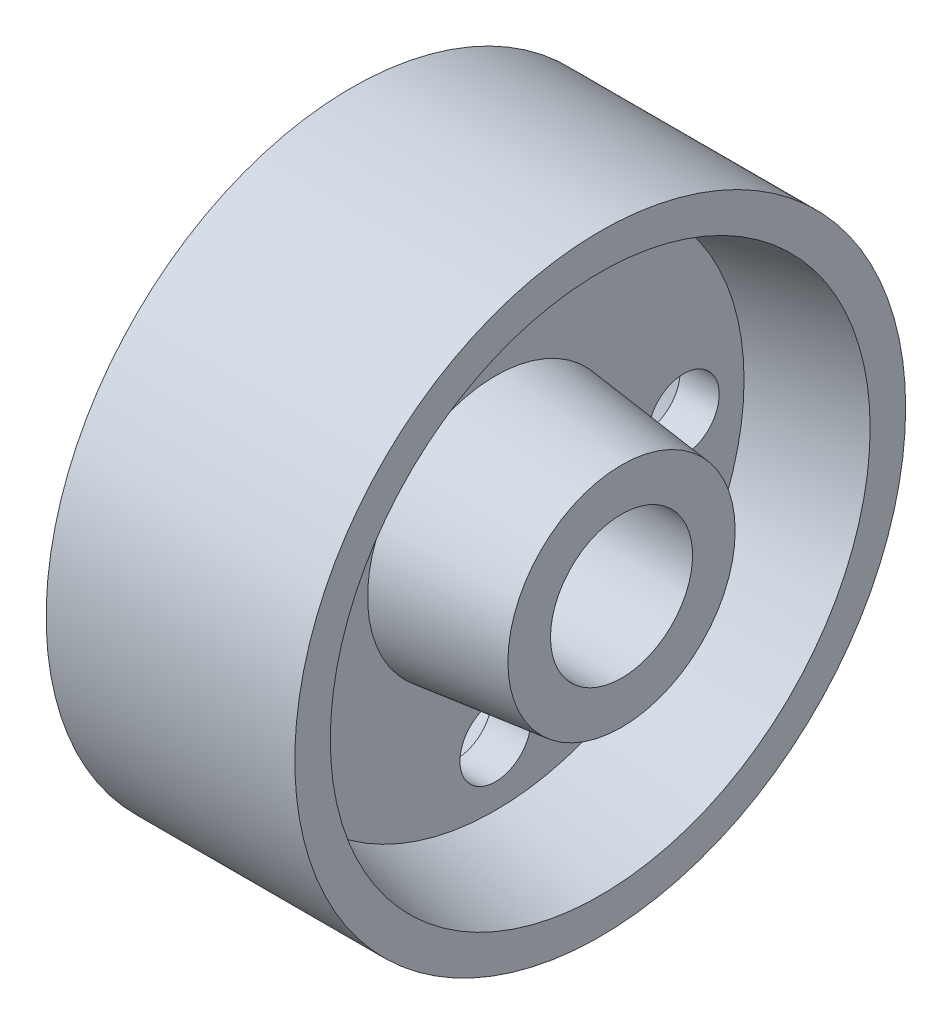
ISO-10303-21;
HEADER;
FILE_DESCRIPTION(('STEP AP214'),'2;1');
FILE_NAME('part.step','',(''),(''),'','','');
FILE_SCHEMA(('AUTOMOTIVE_DESIGN { 1 0 10303 214 1 1 1 1 }'));
ENDSEC;
DATA;
#1=APPLICATION_CONTEXT('core data for automotive mechanical design processes');
#2=APPLICATION_PROTOCOL_DEFINITION('international standard','automotive_design',2000,#1);
#3=PRODUCT_CONTEXT('',#1,'mechanical');
#4=PRODUCT('Part','Part','',(#3));
#5=PRODUCT_RELATED_PRODUCT_CATEGORY('part','',(#4));
#6=PRODUCT_DEFINITION_FORMATION('','',#4);
#7=PRODUCT_DEFINITION_CONTEXT('part definition',#1,'design');
#8=PRODUCT_DEFINITION('design','',#6,#7);
#9=PRODUCT_DEFINITION_SHAPE('','',#8);
#10=(LENGTH_UNIT() NAMED_UNIT(*) SI_UNIT(.MILLI.,.METRE.));
#11=(NAMED_UNIT(*) PLANE_ANGLE_UNIT() SI_UNIT($,.RADIAN.));
#12=(NAMED_UNIT(*) SI_UNIT($,.STERADIAN.) SOLID_ANGLE_UNIT());
#13=UNCERTAINTY_MEASURE_WITH_UNIT(LENGTH_MEASURE(1.E-05),#10,'distance_accuracy_value','');
#14=(GEOMETRIC_REPRESENTATION_CONTEXT(3) GLOBAL_UNCERTAINTY_ASSIGNED_CONTEXT((#13)) GLOBAL_UNIT_ASSIGNED_CONTEXT((#10,
#11,#12)) REPRESENTATION_CONTEXT('',''));
#15=CARTESIAN_POINT('',(0.,0.,0.));
#16=DIRECTION('',(0.,0.,1.));
#17=DIRECTION('',(1.,0.,0.));
#18=AXIS2_PLACEMENT_3D('',#15,#16,#17);
#19=CARTESIAN_POINT('',(-17.5,0.,0.));
#20=DIRECTION('',(-1.,0.,0.));
#21=DIRECTION('',(0.,0.,1.));
#22=AXIS2_PLACEMENT_3D('',#19,#20,#21);
#23=CONICAL_SURFACE('',#22,38.,0.200652877319886);
#24=CARTESIAN_POINT('',(-2.75,0.,0.));
#25=DIRECTION('',(1.,0.,0.));
#26=DIRECTION('',(0.,0.,-1.));
#27=AXIS2_PLACEMENT_3D('',#24,#25,#26);
#28=CIRCLE('',#27,35.);
#29=CARTESIAN_POINT('',(-2.75,0.,-35.));
#30=VERTEX_POINT('',#29);
#31=EDGE_CURVE('E76',#30,#30,#28,.T.);
#32=ORIENTED_EDGE('',*,*,#31,.T.);
#33=EDGE_LOOP('',(#32));
#34=FACE_BOUND('',#33,.T.);
#35=CARTESIAN_POINT('',(-17.5,0.,0.));
#36=DIRECTION('',(1.,0.,0.));
#37=DIRECTION('',(0.,0.,-1.));
#38=AXIS2_PLACEMENT_3D('',#35,#36,#37);
#39=CIRCLE('',#38,38.);
#40=CARTESIAN_POINT('',(-17.5,0.,-38.));
#41=VERTEX_POINT('',#40);
#42=EDGE_CURVE('E10',#41,#41,#39,.T.);
#43=ORIENTED_EDGE('',*,*,#42,.F.);
#44=EDGE_LOOP('',(#43));
#45=FACE_BOUND('',#44,.T.);
#46=ADVANCED_FACE('F35',(#34,#45),#23,.F.);
#47=CARTESIAN_POINT('',(-17.5,0.,-43.));
#48=DIRECTION('',(-1.,0.,0.));
#49=DIRECTION('',(0.,0.,1.));
#50=AXIS2_PLACEMENT_3D('',#47,#48,#49);
#51=PLANE('',#50);
#52=ORIENTED_EDGE('',*,*,#42,.T.);
#53=EDGE_LOOP('',(#52));
#54=FACE_BOUND('',#53,.T.);
#55=CARTESIAN_POINT('',(-17.5,0.,0.));
#56=DIRECTION('',(1.,0.,0.));
#57=DIRECTION('',(0.,0.,-1.));
#58=AXIS2_PLACEMENT_3D('',#55,#56,#57);
#59=CIRCLE('',#58,43.);
#60=CARTESIAN_POINT('',(-17.5,0.,-43.));
#61=VERTEX_POINT('',#60);
#62=EDGE_CURVE('E42',#61,#61,#59,.T.);
#63=ORIENTED_EDGE('',*,*,#62,.F.);
#64=EDGE_LOOP('',(#63));
#65=FACE_BOUND('',#64,.T.);
#66=ADVANCED_FACE('F104',(#54,#65),#51,.T.);
#67=CARTESIAN_POINT('',(20.5,0.,0.));
#68=DIRECTION('',(1.,0.,0.));
#69=DIRECTION('',(0.,0.,-1.));
#70=AXIS2_PLACEMENT_3D('',#67,#68,#69);
#71=CYLINDRICAL_SURFACE('',#70,43.);
#72=ORIENTED_EDGE('',*,*,#62,.T.);
#73=EDGE_LOOP('',(#72));
#74=FACE_BOUND('',#73,.T.);
#75=CARTESIAN_POINT('',(17.5,0.,0.));
#76=DIRECTION('',(1.,0.,0.));
#77=DIRECTION('',(0.,0.,-1.));
#78=AXIS2_PLACEMENT_3D('',#75,#76,#77);
#79=CIRCLE('',#78,43.);
#80=CARTESIAN_POINT('',(17.5,0.,-43.));
#81=VERTEX_POINT('',#80);
#82=EDGE_CURVE('E47',#81,#81,#79,.T.);
#83=ORIENTED_EDGE('',*,*,#82,.F.);
#84=EDGE_LOOP('',(#83));
#85=FACE_BOUND('',#84,.T.);
#86=ADVANCED_FACE('F102',(#74,#85),#71,.T.);
#87=CARTESIAN_POINT('',(17.5,0.,-43.));
#88=DIRECTION('',(1.,0.,0.));
#89=DIRECTION('',(0.,0.,-1.));
#90=AXIS2_PLACEMENT_3D('',#87,#88,#89);
#91=PLANE('',#90);
#92=ORIENTED_EDGE('',*,*,#82,.T.);
#93=EDGE_LOOP('',(#92));
#94=FACE_BOUND('',#93,.T.);
#95=CARTESIAN_POINT('',(17.5,0.,0.));
#96=DIRECTION('',(1.,0.,0.));
#97=DIRECTION('',(0.,0.,-1.));
#98=AXIS2_PLACEMENT_3D('',#95,#96,#97);
#99=CIRCLE('',#98,38.);
#100=CARTESIAN_POINT('',(17.5,0.,-38.));
#101=VERTEX_POINT('',#100);
#102=EDGE_CURVE('E94',#101,#101,#99,.T.);
#103=ORIENTED_EDGE('',*,*,#102,.F.);
#104=EDGE_LOOP('',(#103));
#105=FACE_BOUND('',#104,.T.);
#106=ADVANCED_FACE('F99',(#94,#105),#91,.T.);
#107=CARTESIAN_POINT('',(2.75,0.,0.));
#108=DIRECTION('',(1.,0.,0.));
#109=DIRECTION('',(0.,0.,-1.));
#110=AXIS2_PLACEMENT_3D('',#107,#108,#109);
#111=CONICAL_SURFACE('',#110,35.,0.200652877319886);
#112=ORIENTED_EDGE('',*,*,#102,.T.);
#113=EDGE_LOOP('',(#112));
#114=FACE_BOUND('',#113,.T.);
#115=CARTESIAN_POINT('',(2.75,0.,0.));
#116=DIRECTION('',(1.,0.,0.));
#117=DIRECTION('',(0.,0.,-1.));
#118=AXIS2_PLACEMENT_3D('',#115,#116,#117);
#119=CIRCLE('',#118,35.);
#120=CARTESIAN_POINT('',(2.75,0.,-35.));
#121=VERTEX_POINT('',#120);
#122=EDGE_CURVE('E91',#121,#121,#119,.T.);
#123=ORIENTED_EDGE('',*,*,#122,.F.);
#124=EDGE_LOOP('',(#123));
#125=FACE_BOUND('',#124,.T.);
#126=ADVANCED_FACE('F111',(#114,#125),#111,.F.);
#127=CARTESIAN_POINT('',(2.75,0.,-35.));
#128=DIRECTION('',(1.,0.,0.));
#129=DIRECTION('',(0.,0.,-1.));
#130=AXIS2_PLACEMENT_3D('',#127,#128,#129);
#131=PLANE('',#130);
#132=CARTESIAN_POINT('',(2.75,26.5,0.));
#133=DIRECTION('',(1.,0.,0.));
#134=DIRECTION('',(0.,0.,-1.));
#135=AXIS2_PLACEMENT_3D('',#132,#133,#134);
#136=CIRCLE('',#135,5.);
#137=CARTESIAN_POINT('',(2.75,26.5,-5.));
#138=VERTEX_POINT('',#137);
#139=EDGE_CURVE('E73',#138,#138,#136,.T.);
#140=ORIENTED_EDGE('',*,*,#139,.F.);
#141=EDGE_LOOP('',(#140));
#142=FACE_BOUND('',#141,.T.);
#143=CARTESIAN_POINT('',(2.75,0.,26.5));
#144=DIRECTION('',(1.,0.,0.));
#145=DIRECTION('',(0.,0.,-1.));
#146=AXIS2_PLACEMENT_3D('',#143,#144,#145);
#147=CIRCLE('',#146,5.);
#148=CARTESIAN_POINT('',(2.75,0.,21.5));
#149=VERTEX_POINT('',#148);
#150=EDGE_CURVE('E61',#149,#149,#147,.T.);
#151=ORIENTED_EDGE('',*,*,#150,.F.);
#152=EDGE_LOOP('',(#151));
#153=FACE_BOUND('',#152,.T.);
#154=CARTESIAN_POINT('',(2.75,-26.5,0.));
#155=DIRECTION('',(1.,0.,0.));
#156=DIRECTION('',(0.,0.,-1.));
#157=AXIS2_PLACEMENT_3D('',#154,#155,#156);
#158=CIRCLE('',#157,5.);
#159=CARTESIAN_POINT('',(2.75,-26.5,-5.));
#160=VERTEX_POINT('',#159);
#161=EDGE_CURVE('E58',#160,#160,#158,.T.);
#162=ORIENTED_EDGE('',*,*,#161,.F.);
#163=EDGE_LOOP('',(#162));
#164=FACE_BOUND('',#163,.T.);
#165=CARTESIAN_POINT('',(2.75,0.,-26.5));
#166=DIRECTION('',(1.,0.,0.));
#167=DIRECTION('',(0.,0.,-1.));
#168=AXIS2_PLACEMENT_3D('',#165,#166,#167);
#169=CIRCLE('',#168,5.);
#170=CARTESIAN_POINT('',(2.75,0.,-31.5));
#171=VERTEX_POINT('',#170);
#172=EDGE_CURVE('E54',#171,#171,#169,.T.);
#173=ORIENTED_EDGE('',*,*,#172,.F.);
#174=EDGE_LOOP('',(#173));
#175=FACE_BOUND('',#174,.T.);
#176=ORIENTED_EDGE('',*,*,#122,.T.);
#177=EDGE_LOOP('',(#176));
#178=FACE_BOUND('',#177,.T.);
#179=CARTESIAN_POINT('',(2.75,0.,0.));
#180=DIRECTION('',(1.,0.,0.));
#181=DIRECTION('',(0.,0.,-1.));
#182=AXIS2_PLACEMENT_3D('',#179,#180,#181);
#183=CIRCLE('',#182,18.);
#184=CARTESIAN_POINT('',(2.75,0.,-18.));
#185=VERTEX_POINT('',#184);
#186=EDGE_CURVE('E88',#185,#185,#183,.T.);
#187=ORIENTED_EDGE('',*,*,#186,.F.);
#188=EDGE_LOOP('',(#187));
#189=FACE_BOUND('',#188,.T.);
#190=ADVANCED_FACE('F150',(#142,#153,#164,#175,#178,#189),#131,.T.);
#191=CARTESIAN_POINT('',(20.5,0.,0.));
#192=DIRECTION('',(-1.,0.,0.));
#193=DIRECTION('',(0.,0.,1.));
#194=AXIS2_PLACEMENT_3D('',#191,#192,#193);
#195=CONICAL_SURFACE('',#194,16.,0.112202814997254);
#196=ORIENTED_EDGE('',*,*,#186,.T.);
#197=EDGE_LOOP('',(#196));
#198=FACE_BOUND('',#197,.T.);
#199=CARTESIAN_POINT('',(20.5,0.,0.));
#200=DIRECTION('',(1.,0.,0.));
#201=DIRECTION('',(0.,0.,-1.));
#202=AXIS2_PLACEMENT_3D('',#199,#200,#201);
#203=CIRCLE('',#202,16.);
#204=CARTESIAN_POINT('',(20.5,0.,-16.));
#205=VERTEX_POINT('',#204);
#206=EDGE_CURVE('E85',#205,#205,#203,.T.);
#207=ORIENTED_EDGE('',*,*,#206,.F.);
#208=EDGE_LOOP('',(#207));
#209=FACE_BOUND('',#208,.T.);
#210=ADVANCED_FACE('F146',(#198,#209),#195,.T.);
#211=CARTESIAN_POINT('',(20.5,0.,0.));
#212=DIRECTION('',(1.,0.,0.));
#213=DIRECTION('',(0.,0.,-1.));
#214=AXIS2_PLACEMENT_3D('',#211,#212,#213);
#215=PLANE('',#214);
#216=CARTESIAN_POINT('',(20.5,0.,0.));
#217=DIRECTION('',(-1.,0.,0.));
#218=DIRECTION('',(0.,0.,1.));
#219=AXIS2_PLACEMENT_3D('',#216,#217,#218);
#220=CIRCLE('',#219,10.);
#221=CARTESIAN_POINT('',(20.5,0.,10.));
#222=VERTEX_POINT('',#221);
#223=EDGE_CURVE('E55',#222,#222,#220,.T.);
#224=ORIENTED_EDGE('',*,*,#223,.T.);
#225=EDGE_LOOP('',(#224));
#226=FACE_BOUND('',#225,.T.);
#227=ORIENTED_EDGE('',*,*,#206,.T.);
#228=EDGE_LOOP('',(#227));
#229=FACE_BOUND('',#228,.T.);
#230=ADVANCED_FACE('F142',(#226,#229),#215,.T.);
#231=CARTESIAN_POINT('',(-20.5,0.,0.));
#232=DIRECTION('',(-1.,0.,0.));
#233=DIRECTION('',(0.,0.,1.));
#234=AXIS2_PLACEMENT_3D('',#231,#232,#233);
#235=PLANE('',#234);
#236=CARTESIAN_POINT('',(-20.5,0.,0.));
#237=DIRECTION('',(-1.,0.,0.));
#238=DIRECTION('',(0.,0.,1.));
#239=AXIS2_PLACEMENT_3D('',#236,#237,#238);
#240=CIRCLE('',#239,10.);
#241=CARTESIAN_POINT('',(-20.5,0.,10.));
#242=VERTEX_POINT('',#241);
#243=EDGE_CURVE('E263',#242,#242,#240,.T.);
#244=ORIENTED_EDGE('',*,*,#243,.F.);
#245=EDGE_LOOP('',(#244));
#246=FACE_BOUND('',#245,.T.);
#247=CARTESIAN_POINT('',(-20.5,0.,0.));
#248=DIRECTION('',(1.,0.,0.));
#249=DIRECTION('',(0.,0.,-1.));
#250=AXIS2_PLACEMENT_3D('',#247,#248,#249);
#251=CIRCLE('',#250,16.);
#252=CARTESIAN_POINT('',(-20.5,0.,-16.));
#253=VERTEX_POINT('',#252);
#254=EDGE_CURVE('E82',#253,#253,#251,.T.);
#255=ORIENTED_EDGE('',*,*,#254,.F.);
#256=EDGE_LOOP('',(#255));
#257=FACE_BOUND('',#256,.T.);
#258=ADVANCED_FACE('F133',(#246,#257),#235,.T.);
#259=CARTESIAN_POINT('',(-2.75,0.,0.));
#260=DIRECTION('',(1.,0.,0.));
#261=DIRECTION('',(0.,0.,-1.));
#262=AXIS2_PLACEMENT_3D('',#259,#260,#261);
#263=CONICAL_SURFACE('',#262,18.,0.112202814997254);
#264=ORIENTED_EDGE('',*,*,#254,.T.);
#265=EDGE_LOOP('',(#264));
#266=FACE_BOUND('',#265,.T.);
#267=CARTESIAN_POINT('',(-2.75,0.,0.));
#268=DIRECTION('',(1.,0.,0.));
#269=DIRECTION('',(0.,0.,-1.));
#270=AXIS2_PLACEMENT_3D('',#267,#268,#269);
#271=CIRCLE('',#270,18.);
#272=CARTESIAN_POINT('',(-2.75,0.,-18.));
#273=VERTEX_POINT('',#272);
#274=EDGE_CURVE('E79',#273,#273,#271,.T.);
#275=ORIENTED_EDGE('',*,*,#274,.F.);
#276=EDGE_LOOP('',(#275));
#277=FACE_BOUND('',#276,.T.);
#278=ADVANCED_FACE('F123',(#266,#277),#263,.T.);
#279=CARTESIAN_POINT('',(-2.75,0.,-35.));
#280=DIRECTION('',(-1.,0.,0.));
#281=DIRECTION('',(0.,0.,1.));
#282=AXIS2_PLACEMENT_3D('',#279,#280,#281);
#283=PLANE('',#282);
#284=CARTESIAN_POINT('',(-2.75,26.5,0.));
#285=DIRECTION('',(-1.,0.,0.));
#286=DIRECTION('',(0.,0.,1.));
#287=AXIS2_PLACEMENT_3D('',#284,#285,#286);
#288=CIRCLE('',#287,5.);
#289=CARTESIAN_POINT('',(-2.75,26.5,5.));
#290=VERTEX_POINT('',#289);
#291=EDGE_CURVE('E38',#290,#290,#288,.T.);
#292=ORIENTED_EDGE('',*,*,#291,.F.);
#293=EDGE_LOOP('',(#292));
#294=FACE_BOUND('',#293,.T.);
#295=CARTESIAN_POINT('',(-2.75,0.,26.5));
#296=DIRECTION('',(-1.,0.,0.));
#297=DIRECTION('',(0.,0.,1.));
#298=AXIS2_PLACEMENT_3D('',#295,#296,#297);
#299=CIRCLE('',#298,5.);
#300=CARTESIAN_POINT('',(-2.75,0.,31.5));
#301=VERTEX_POINT('',#300);
#302=EDGE_CURVE('E59',#301,#301,#299,.T.);
#303=ORIENTED_EDGE('',*,*,#302,.F.);
#304=EDGE_LOOP('',(#303));
#305=FACE_BOUND('',#304,.T.);
#306=CARTESIAN_POINT('',(-2.75,-26.5,0.));
#307=DIRECTION('',(-1.,0.,0.));
#308=DIRECTION('',(0.,0.,1.));
#309=AXIS2_PLACEMENT_3D('',#306,#307,#308);
#310=CIRCLE('',#309,5.);
#311=CARTESIAN_POINT('',(-2.75,-26.5,5.));
#312=VERTEX_POINT('',#311);
#313=EDGE_CURVE('E56',#312,#312,#310,.T.);
#314=ORIENTED_EDGE('',*,*,#313,.F.);
#315=EDGE_LOOP('',(#314));
#316=FACE_BOUND('',#315,.T.);
#317=CARTESIAN_POINT('',(-2.75,0.,-26.5));
#318=DIRECTION('',(-1.,0.,0.));
#319=DIRECTION('',(0.,0.,1.));
#320=AXIS2_PLACEMENT_3D('',#317,#318,#319);
#321=CIRCLE('',#320,5.);
#322=CARTESIAN_POINT('',(-2.75,0.,-21.5));
#323=VERTEX_POINT('',#322);
#324=EDGE_CURVE('E51',#323,#323,#321,.T.);
#325=ORIENTED_EDGE('',*,*,#324,.F.);
#326=EDGE_LOOP('',(#325));
#327=FACE_BOUND('',#326,.T.);
#328=ORIENTED_EDGE('',*,*,#274,.T.);
#329=EDGE_LOOP('',(#328));
#330=FACE_BOUND('',#329,.T.);
#331=ORIENTED_EDGE('',*,*,#31,.F.);
#332=EDGE_LOOP('',(#331));
#333=FACE_BOUND('',#332,.T.);
#334=ADVANCED_FACE('F120',(#294,#305,#316,#327,#330,#333),#283,.T.);
#335=CARTESIAN_POINT('',(20.5,0.,-26.5));
#336=DIRECTION('',(-1.,0.,0.));
#337=DIRECTION('',(0.,0.,1.));
#338=AXIS2_PLACEMENT_3D('',#335,#336,#337);
#339=CYLINDRICAL_SURFACE('',#338,5.);
#340=ORIENTED_EDGE('',*,*,#172,.T.);
#341=EDGE_LOOP('',(#340));
#342=FACE_BOUND('',#341,.T.);
#343=ORIENTED_EDGE('',*,*,#324,.T.);
#344=EDGE_LOOP('',(#343));
#345=FACE_BOUND('',#344,.T.);
#346=ADVANCED_FACE('F122',(#342,#345),#339,.F.);
#347=CARTESIAN_POINT('',(20.5,-26.5,0.));
#348=DIRECTION('',(-1.,0.,0.));
#349=DIRECTION('',(0.,0.,1.));
#350=AXIS2_PLACEMENT_3D('',#347,#348,#349);
#351=CYLINDRICAL_SURFACE('',#350,5.);
#352=ORIENTED_EDGE('',*,*,#161,.T.);
#353=EDGE_LOOP('',(#352));
#354=FACE_BOUND('',#353,.T.);
#355=ORIENTED_EDGE('',*,*,#313,.T.);
#356=EDGE_LOOP('',(#355));
#357=FACE_BOUND('',#356,.T.);
#358=ADVANCED_FACE('F130',(#354,#357),#351,.F.);
#359=CARTESIAN_POINT('',(20.5,0.,26.5));
#360=DIRECTION('',(-1.,0.,0.));
#361=DIRECTION('',(0.,0.,1.));
#362=AXIS2_PLACEMENT_3D('',#359,#360,#361);
#363=CYLINDRICAL_SURFACE('',#362,5.);
#364=ORIENTED_EDGE('',*,*,#150,.T.);
#365=EDGE_LOOP('',(#364));
#366=FACE_BOUND('',#365,.T.);
#367=ORIENTED_EDGE('',*,*,#302,.T.);
#368=EDGE_LOOP('',(#367));
#369=FACE_BOUND('',#368,.T.);
#370=ADVANCED_FACE('F221',(#366,#369),#363,.F.);
#371=CARTESIAN_POINT('',(20.5,26.5,0.));
#372=DIRECTION('',(-1.,0.,0.));
#373=DIRECTION('',(0.,0.,1.));
#374=AXIS2_PLACEMENT_3D('',#371,#372,#373);
#375=CYLINDRICAL_SURFACE('',#374,5.);
#376=ORIENTED_EDGE('',*,*,#139,.T.);
#377=EDGE_LOOP('',(#376));
#378=FACE_BOUND('',#377,.T.);
#379=ORIENTED_EDGE('',*,*,#291,.T.);
#380=EDGE_LOOP('',(#379));
#381=FACE_BOUND('',#380,.T.);
#382=ADVANCED_FACE('F230',(#378,#381),#375,.F.);
#383=CARTESIAN_POINT('',(20.5,0.,0.));
#384=DIRECTION('',(-1.,0.,0.));
#385=DIRECTION('',(0.,0.,1.));
#386=AXIS2_PLACEMENT_3D('',#383,#384,#385);
#387=CYLINDRICAL_SURFACE('',#386,10.);
#388=ORIENTED_EDGE('',*,*,#223,.F.);
#389=EDGE_LOOP('',(#388));
#390=FACE_BOUND('',#389,.T.);
#391=ORIENTED_EDGE('',*,*,#243,.T.);
#392=EDGE_LOOP('',(#391));
#393=FACE_BOUND('',#392,.T.);
#394=ADVANCED_FACE('F240',(#390,#393),#387,.F.);
#395=CLOSED_SHELL('',(#46,#66,#86,#106,#126,#190,#210,#230,#258,#278,#334,#346,#358,#370,#382,#394));
#396=MANIFOLD_SOLID_BREP('B2',#395);
#397=ADVANCED_BREP_SHAPE_REPRESENTATION('',(#18,#396),#14);
#398=SHAPE_DEFINITION_REPRESENTATION(#9,#397);
ENDSEC;
END-ISO-10303-21;
